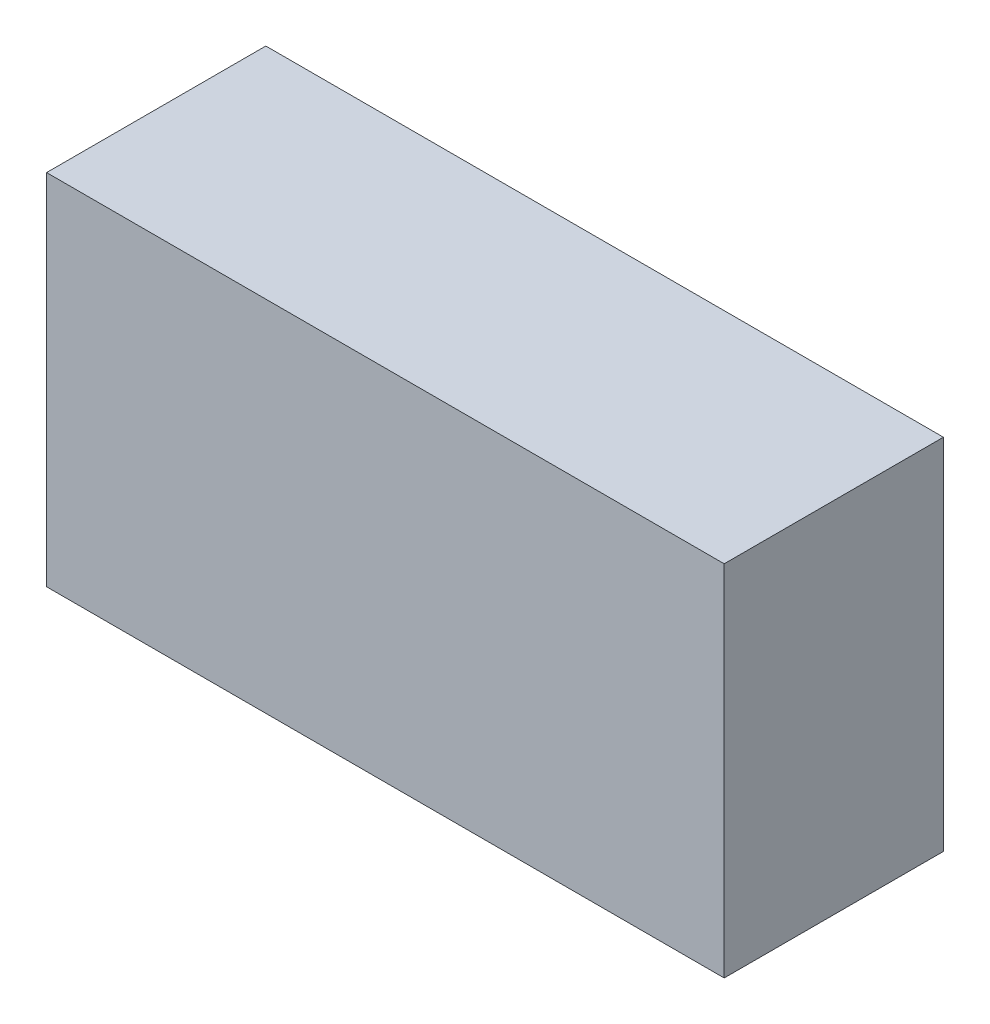
ISO-10303-21;
HEADER;
FILE_DESCRIPTION(('STEP AP214'),'2;1');
FILE_NAME('part.step','',(''),(''),'','','');
FILE_SCHEMA(('AUTOMOTIVE_DESIGN { 1 0 10303 214 1 1 1 1 }'));
ENDSEC;
DATA;
#1=APPLICATION_CONTEXT('core data for automotive mechanical design processes');
#2=APPLICATION_PROTOCOL_DEFINITION('international standard','automotive_design',2000,#1);
#3=PRODUCT_CONTEXT('',#1,'mechanical');
#4=PRODUCT('Part','Part','',(#3));
#5=PRODUCT_RELATED_PRODUCT_CATEGORY('part','',(#4));
#6=PRODUCT_DEFINITION_FORMATION('','',#4);
#7=PRODUCT_DEFINITION_CONTEXT('part definition',#1,'design');
#8=PRODUCT_DEFINITION('design','',#6,#7);
#9=PRODUCT_DEFINITION_SHAPE('','',#8);
#10=(LENGTH_UNIT() NAMED_UNIT(*) SI_UNIT(.MILLI.,.METRE.));
#11=(NAMED_UNIT(*) PLANE_ANGLE_UNIT() SI_UNIT($,.RADIAN.));
#12=(NAMED_UNIT(*) SI_UNIT($,.STERADIAN.) SOLID_ANGLE_UNIT());
#13=UNCERTAINTY_MEASURE_WITH_UNIT(LENGTH_MEASURE(1.E-05),#10,'distance_accuracy_value','');
#14=(GEOMETRIC_REPRESENTATION_CONTEXT(3) GLOBAL_UNCERTAINTY_ASSIGNED_CONTEXT((#13)) GLOBAL_UNIT_ASSIGNED_CONTEXT((#10,
#11,#12)) REPRESENTATION_CONTEXT('',''));
#15=CARTESIAN_POINT('',(0.,0.,0.));
#16=DIRECTION('',(0.,0.,1.));
#17=DIRECTION('',(1.,0.,0.));
#18=AXIS2_PLACEMENT_3D('',#15,#16,#17);
#19=CARTESIAN_POINT('',(3.,23.,37.));
#20=DIRECTION('',(1.,0.,0.));
#21=DIRECTION('',(0.,0.,-1.));
#22=AXIS2_PLACEMENT_3D('',#19,#20,#21);
#23=PLANE('',#22);
#24=DIRECTION('',(0.,-1.,0.));
#25=VECTOR('',#24,1.);
#26=CARTESIAN_POINT('',(3.,23.,26.));
#27=LINE('',#26,#25);
#28=CARTESIAN_POINT('',(3.,23.,26.));
#29=VERTEX_POINT('',#28);
#30=CARTESIAN_POINT('',(3.,5.,26.));
#31=VERTEX_POINT('',#30);
#32=EDGE_CURVE('E104',#29,#31,#27,.T.);
#33=ORIENTED_EDGE('',*,*,#32,.T.);
#34=DIRECTION('',(0.,0.,-1.));
#35=VECTOR('',#34,1.);
#36=CARTESIAN_POINT('',(3.,5.,37.));
#37=LINE('',#36,#35);
#38=CARTESIAN_POINT('',(3.,5.,37.));
#39=VERTEX_POINT('',#38);
#40=EDGE_CURVE('E11',#39,#31,#37,.T.);
#41=ORIENTED_EDGE('',*,*,#40,.F.);
#42=DIRECTION('',(0.,-1.,0.));
#43=VECTOR('',#42,1.);
#44=CARTESIAN_POINT('',(3.,23.,37.));
#45=LINE('',#44,#43);
#46=CARTESIAN_POINT('',(3.,23.,37.));
#47=VERTEX_POINT('',#46);
#48=EDGE_CURVE('E92',#47,#39,#45,.T.);
#49=ORIENTED_EDGE('',*,*,#48,.F.);
#50=DIRECTION('',(0.,0.,-1.));
#51=VECTOR('',#50,1.);
#52=CARTESIAN_POINT('',(3.,23.,37.));
#53=LINE('',#52,#51);
#54=EDGE_CURVE('E100',#47,#29,#53,.T.);
#55=ORIENTED_EDGE('',*,*,#54,.T.);
#56=EDGE_LOOP('',(#33,#41,#49,#55));
#57=FACE_BOUND('',#56,.T.);
#58=ADVANCED_FACE('F41',(#57),#23,.F.);
#59=CARTESIAN_POINT('',(3.,5.,37.));
#60=DIRECTION('',(0.,1.,0.));
#61=DIRECTION('',(0.,0.,1.));
#62=AXIS2_PLACEMENT_3D('',#59,#60,#61);
#63=PLANE('',#62);
#64=DIRECTION('',(1.,0.,0.));
#65=VECTOR('',#64,1.);
#66=CARTESIAN_POINT('',(3.,5.,26.));
#67=LINE('',#66,#65);
#68=CARTESIAN_POINT('',(37.,5.,26.));
#69=VERTEX_POINT('',#68);
#70=EDGE_CURVE('E96',#31,#69,#67,.T.);
#71=ORIENTED_EDGE('',*,*,#70,.T.);
#72=DIRECTION('',(0.,0.,-1.));
#73=VECTOR('',#72,1.);
#74=CARTESIAN_POINT('',(37.,5.,37.));
#75=LINE('',#74,#73);
#76=CARTESIAN_POINT('',(37.,5.,37.));
#77=VERTEX_POINT('',#76);
#78=EDGE_CURVE('E49',#77,#69,#75,.T.);
#79=ORIENTED_EDGE('',*,*,#78,.F.);
#80=DIRECTION('',(1.,0.,0.));
#81=VECTOR('',#80,1.);
#82=CARTESIAN_POINT('',(3.,5.,37.));
#83=LINE('',#82,#81);
#84=EDGE_CURVE('E87',#39,#77,#83,.T.);
#85=ORIENTED_EDGE('',*,*,#84,.F.);
#86=ORIENTED_EDGE('',*,*,#40,.T.);
#87=EDGE_LOOP('',(#71,#79,#85,#86));
#88=FACE_BOUND('',#87,.T.);
#89=ADVANCED_FACE('F95',(#88),#63,.F.);
#90=CARTESIAN_POINT('',(37.,5.,37.));
#91=DIRECTION('',(-1.,0.,0.));
#92=DIRECTION('',(0.,0.,1.));
#93=AXIS2_PLACEMENT_3D('',#90,#91,#92);
#94=PLANE('',#93);
#95=DIRECTION('',(0.,1.,0.));
#96=VECTOR('',#95,1.);
#97=CARTESIAN_POINT('',(37.,5.,26.));
#98=LINE('',#97,#96);
#99=CARTESIAN_POINT('',(37.,23.,26.));
#100=VERTEX_POINT('',#99);
#101=EDGE_CURVE('E74',#69,#100,#98,.T.);
#102=ORIENTED_EDGE('',*,*,#101,.T.);
#103=DIRECTION('',(0.,0.,-1.));
#104=VECTOR('',#103,1.);
#105=CARTESIAN_POINT('',(37.,23.,37.));
#106=LINE('',#105,#104);
#107=CARTESIAN_POINT('',(37.,23.,37.));
#108=VERTEX_POINT('',#107);
#109=EDGE_CURVE('E97',#108,#100,#106,.T.);
#110=ORIENTED_EDGE('',*,*,#109,.F.);
#111=DIRECTION('',(0.,1.,0.));
#112=VECTOR('',#111,1.);
#113=CARTESIAN_POINT('',(37.,5.,37.));
#114=LINE('',#113,#112);
#115=EDGE_CURVE('E90',#77,#108,#114,.T.);
#116=ORIENTED_EDGE('',*,*,#115,.F.);
#117=ORIENTED_EDGE('',*,*,#78,.T.);
#118=EDGE_LOOP('',(#102,#110,#116,#117));
#119=FACE_BOUND('',#118,.T.);
#120=ADVANCED_FACE('F98',(#119),#94,.F.);
#121=CARTESIAN_POINT('',(37.,23.,37.));
#122=DIRECTION('',(0.,-1.,0.));
#123=DIRECTION('',(0.,0.,-1.));
#124=AXIS2_PLACEMENT_3D('',#121,#122,#123);
#125=PLANE('',#124);
#126=DIRECTION('',(-1.,0.,0.));
#127=VECTOR('',#126,1.);
#128=CARTESIAN_POINT('',(37.,23.,26.));
#129=LINE('',#128,#127);
#130=EDGE_CURVE('E80',#100,#29,#129,.T.);
#131=ORIENTED_EDGE('',*,*,#130,.T.);
#132=ORIENTED_EDGE('',*,*,#54,.F.);
#133=DIRECTION('',(-1.,0.,0.));
#134=VECTOR('',#133,1.);
#135=CARTESIAN_POINT('',(37.,23.,37.));
#136=LINE('',#135,#134);
#137=EDGE_CURVE('E57',#108,#47,#136,.T.);
#138=ORIENTED_EDGE('',*,*,#137,.F.);
#139=ORIENTED_EDGE('',*,*,#109,.T.);
#140=EDGE_LOOP('',(#131,#132,#138,#139));
#141=FACE_BOUND('',#140,.T.);
#142=ADVANCED_FACE('F111',(#141),#125,.F.);
#143=CARTESIAN_POINT('',(0.,0.,37.));
#144=DIRECTION('',(0.,0.,1.));
#145=DIRECTION('',(1.,0.,0.));
#146=AXIS2_PLACEMENT_3D('',#143,#144,#145);
#147=PLANE('',#146);
#148=ORIENTED_EDGE('',*,*,#48,.T.);
#149=ORIENTED_EDGE('',*,*,#84,.T.);
#150=ORIENTED_EDGE('',*,*,#115,.T.);
#151=ORIENTED_EDGE('',*,*,#137,.T.);
#152=EDGE_LOOP('',(#148,#149,#150,#151));
#153=FACE_BOUND('',#152,.T.);
#154=ADVANCED_FACE('F88',(#153),#147,.T.);
#155=CARTESIAN_POINT('',(0.,0.,26.));
#156=DIRECTION('',(0.,0.,1.));
#157=DIRECTION('',(1.,0.,0.));
#158=AXIS2_PLACEMENT_3D('',#155,#156,#157);
#159=PLANE('',#158);
#160=ORIENTED_EDGE('',*,*,#32,.F.);
#161=ORIENTED_EDGE('',*,*,#130,.F.);
#162=ORIENTED_EDGE('',*,*,#101,.F.);
#163=ORIENTED_EDGE('',*,*,#70,.F.);
#164=EDGE_LOOP('',(#160,#161,#162,#163));
#165=FACE_BOUND('',#164,.T.);
#166=ADVANCED_FACE('F114',(#165),#159,.F.);
#167=CLOSED_SHELL('',(#58,#89,#120,#142,#154,#166));
#168=MANIFOLD_SOLID_BREP('B2',#167);
#169=ADVANCED_BREP_SHAPE_REPRESENTATION('',(#18,#168),#14);
#170=SHAPE_DEFINITION_REPRESENTATION(#9,#169);
ENDSEC;
END-ISO-10303-21;
